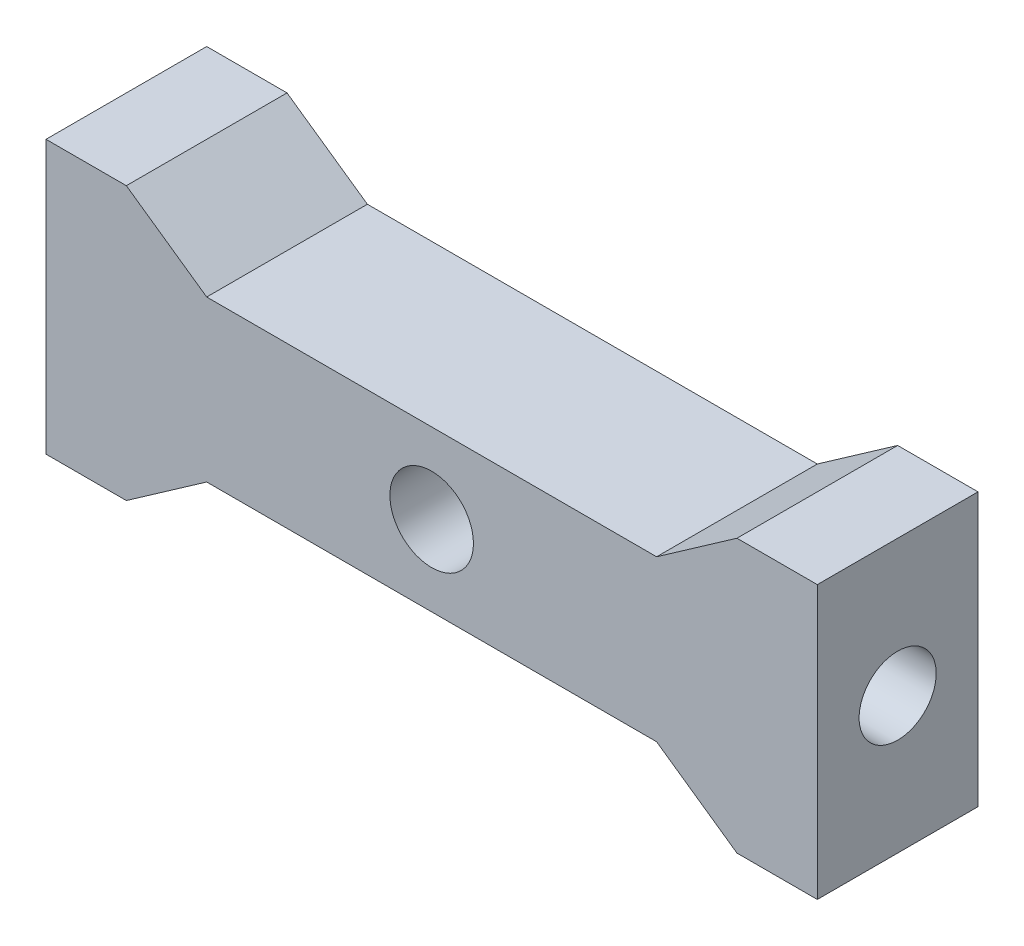
ISO-10303-21;
HEADER;
FILE_DESCRIPTION(('STEP AP214'),'2;1');
FILE_NAME('part.step','',(''),(''),'','','');
FILE_SCHEMA(('AUTOMOTIVE_DESIGN { 1 0 10303 214 1 1 1 1 }'));
ENDSEC;
DATA;
#1=APPLICATION_CONTEXT('core data for automotive mechanical design processes');
#2=APPLICATION_PROTOCOL_DEFINITION('international standard','automotive_design',2000,#1);
#3=PRODUCT_CONTEXT('',#1,'mechanical');
#4=PRODUCT('Part','Part','',(#3));
#5=PRODUCT_RELATED_PRODUCT_CATEGORY('part','',(#4));
#6=PRODUCT_DEFINITION_FORMATION('','',#4);
#7=PRODUCT_DEFINITION_CONTEXT('part definition',#1,'design');
#8=PRODUCT_DEFINITION('design','',#6,#7);
#9=PRODUCT_DEFINITION_SHAPE('','',#8);
#10=(LENGTH_UNIT() NAMED_UNIT(*) SI_UNIT(.MILLI.,.METRE.));
#11=(NAMED_UNIT(*) PLANE_ANGLE_UNIT() SI_UNIT($,.RADIAN.));
#12=(NAMED_UNIT(*) SI_UNIT($,.STERADIAN.) SOLID_ANGLE_UNIT());
#13=UNCERTAINTY_MEASURE_WITH_UNIT(LENGTH_MEASURE(1.E-05),#10,'distance_accuracy_value','');
#14=(GEOMETRIC_REPRESENTATION_CONTEXT(3) GLOBAL_UNCERTAINTY_ASSIGNED_CONTEXT((#13)) GLOBAL_UNIT_ASSIGNED_CONTEXT((#10,
#11,#12)) REPRESENTATION_CONTEXT('',''));
#15=CARTESIAN_POINT('',(0.,0.,0.));
#16=DIRECTION('',(0.,0.,1.));
#17=DIRECTION('',(1.,0.,0.));
#18=AXIS2_PLACEMENT_3D('',#15,#16,#17);
#19=CARTESIAN_POINT('',(-24.,8.485,10.));
#20=DIRECTION('',(0.,-1.,0.));
#21=DIRECTION('',(0.,0.,-1.));
#22=AXIS2_PLACEMENT_3D('',#19,#20,#21);
#23=PLANE('',#22);
#24=DIRECTION('',(-1.,0.,0.));
#25=VECTOR('',#24,1.);
#26=CARTESIAN_POINT('',(-24.,8.485,10.));
#27=LINE('',#26,#25);
#28=CARTESIAN_POINT('',(-19.,8.485,10.));
#29=VERTEX_POINT('',#28);
#30=CARTESIAN_POINT('',(-24.,8.485,10.));
#31=VERTEX_POINT('',#30);
#32=EDGE_CURVE('E245',#29,#31,#27,.T.);
#33=ORIENTED_EDGE('',*,*,#32,.F.);
#34=DIRECTION('',(0.,0.,1.));
#35=VECTOR('',#34,1.);
#36=CARTESIAN_POINT('',(-19.,8.485,0.));
#37=LINE('',#36,#35);
#38=CARTESIAN_POINT('',(-19.,8.485,0.));
#39=VERTEX_POINT('',#38);
#40=EDGE_CURVE('E175',#39,#29,#37,.T.);
#41=ORIENTED_EDGE('',*,*,#40,.F.);
#42=DIRECTION('',(-1.,0.,0.));
#43=VECTOR('',#42,1.);
#44=CARTESIAN_POINT('',(-24.,8.485,0.));
#45=LINE('',#44,#43);
#46=CARTESIAN_POINT('',(-24.,8.485,0.));
#47=VERTEX_POINT('',#46);
#48=EDGE_CURVE('E161',#39,#47,#45,.T.);
#49=ORIENTED_EDGE('',*,*,#48,.T.);
#50=DIRECTION('',(0.,0.,-1.));
#51=VECTOR('',#50,1.);
#52=CARTESIAN_POINT('',(-24.,8.485,10.));
#53=LINE('',#52,#51);
#54=EDGE_CURVE('E54',#31,#47,#53,.T.);
#55=ORIENTED_EDGE('',*,*,#54,.F.);
#56=EDGE_LOOP('',(#33,#41,#49,#55));
#57=FACE_BOUND('',#56,.T.);
#58=ADVANCED_FACE('F45',(#57),#23,.F.);
#59=CARTESIAN_POINT('',(-24.,-8.485,10.));
#60=DIRECTION('',(0.,1.,0.));
#61=DIRECTION('',(0.,0.,1.));
#62=AXIS2_PLACEMENT_3D('',#59,#60,#61);
#63=PLANE('',#62);
#64=DIRECTION('',(1.,0.,0.));
#65=VECTOR('',#64,1.);
#66=CARTESIAN_POINT('',(-24.,-8.485,0.));
#67=LINE('',#66,#65);
#68=CARTESIAN_POINT('',(-24.,-8.485,0.));
#69=VERTEX_POINT('',#68);
#70=CARTESIAN_POINT('',(-19.,-8.485,0.));
#71=VERTEX_POINT('',#70);
#72=EDGE_CURVE('E246',#69,#71,#67,.T.);
#73=ORIENTED_EDGE('',*,*,#72,.T.);
#74=DIRECTION('',(0.,0.,1.));
#75=VECTOR('',#74,1.);
#76=CARTESIAN_POINT('',(-19.,-8.485,0.));
#77=LINE('',#76,#75);
#78=CARTESIAN_POINT('',(-19.,-8.485,10.));
#79=VERTEX_POINT('',#78);
#80=EDGE_CURVE('E184',#71,#79,#77,.T.);
#81=ORIENTED_EDGE('',*,*,#80,.T.);
#82=DIRECTION('',(1.,0.,0.));
#83=VECTOR('',#82,1.);
#84=CARTESIAN_POINT('',(-24.,-8.485,10.));
#85=LINE('',#84,#83);
#86=CARTESIAN_POINT('',(-24.,-8.485,10.));
#87=VERTEX_POINT('',#86);
#88=EDGE_CURVE('E255',#87,#79,#85,.T.);
#89=ORIENTED_EDGE('',*,*,#88,.F.);
#90=DIRECTION('',(0.,0.,-1.));
#91=VECTOR('',#90,1.);
#92=CARTESIAN_POINT('',(-24.,-8.485,10.));
#93=LINE('',#92,#91);
#94=EDGE_CURVE('E277',#87,#69,#93,.T.);
#95=ORIENTED_EDGE('',*,*,#94,.T.);
#96=EDGE_LOOP('',(#73,#81,#89,#95));
#97=FACE_BOUND('',#96,.T.);
#98=ADVANCED_FACE('F292',(#97),#63,.F.);
#99=CARTESIAN_POINT('',(0.,0.,10.));
#100=DIRECTION('',(0.,0.,1.));
#101=DIRECTION('',(1.,0.,0.));
#102=AXIS2_PLACEMENT_3D('',#99,#100,#101);
#103=PLANE('',#102);
#104=DIRECTION('',(0.819231920519041,-0.573462344363328,0.));
#105=VECTOR('',#104,1.);
#106=CARTESIAN_POINT('',(-14.,4.985,10.));
#107=LINE('',#106,#105);
#108=CARTESIAN_POINT('',(-14.,4.985,10.));
#109=VERTEX_POINT('',#108);
#110=EDGE_CURVE('E141',#29,#109,#107,.T.);
#111=ORIENTED_EDGE('',*,*,#110,.F.);
#112=ORIENTED_EDGE('',*,*,#32,.T.);
#113=DIRECTION('',(0.,-1.,0.));
#114=VECTOR('',#113,1.);
#115=CARTESIAN_POINT('',(-24.,8.485,10.));
#116=LINE('',#115,#114);
#117=EDGE_CURVE('E251',#31,#87,#116,.T.);
#118=ORIENTED_EDGE('',*,*,#117,.T.);
#119=ORIENTED_EDGE('',*,*,#88,.T.);
#120=DIRECTION('',(-0.819231920519041,-0.573462344363328,0.));
#121=VECTOR('',#120,1.);
#122=CARTESIAN_POINT('',(-19.,-8.485,10.));
#123=LINE('',#122,#121);
#124=CARTESIAN_POINT('',(-14.,-4.985,10.));
#125=VERTEX_POINT('',#124);
#126=EDGE_CURVE('E172',#125,#79,#123,.T.);
#127=ORIENTED_EDGE('',*,*,#126,.F.);
#128=DIRECTION('',(-1.,0.,0.));
#129=VECTOR('',#128,1.);
#130=CARTESIAN_POINT('',(-14.,-4.985,10.));
#131=LINE('',#130,#129);
#132=CARTESIAN_POINT('',(14.,-4.985,10.));
#133=VERTEX_POINT('',#132);
#134=EDGE_CURVE('E198',#133,#125,#131,.T.);
#135=ORIENTED_EDGE('',*,*,#134,.F.);
#136=DIRECTION('',(-0.819231920519041,0.573462344363328,0.));
#137=VECTOR('',#136,1.);
#138=CARTESIAN_POINT('',(14.,-4.985,10.));
#139=LINE('',#138,#137);
#140=CARTESIAN_POINT('',(19.,-8.485,10.));
#141=VERTEX_POINT('',#140);
#142=EDGE_CURVE('E202',#141,#133,#139,.T.);
#143=ORIENTED_EDGE('',*,*,#142,.F.);
#144=CARTESIAN_POINT('',(24.,-8.485,10.));
#145=VERTEX_POINT('',#144);
#146=EDGE_CURVE('E254',#141,#145,#85,.T.);
#147=ORIENTED_EDGE('',*,*,#146,.T.);
#148=DIRECTION('',(0.,1.,0.));
#149=VECTOR('',#148,1.);
#150=CARTESIAN_POINT('',(24.,8.485,10.));
#151=LINE('',#150,#149);
#152=CARTESIAN_POINT('',(24.,8.485,10.));
#153=VERTEX_POINT('',#152);
#154=EDGE_CURVE('E241',#145,#153,#151,.T.);
#155=ORIENTED_EDGE('',*,*,#154,.T.);
#156=CARTESIAN_POINT('',(19.,8.485,10.));
#157=VERTEX_POINT('',#156);
#158=EDGE_CURVE('E247',#153,#157,#27,.T.);
#159=ORIENTED_EDGE('',*,*,#158,.T.);
#160=DIRECTION('',(0.81923192051904,0.573462344363328,0.));
#161=VECTOR('',#160,1.);
#162=CARTESIAN_POINT('',(14.,4.985,10.));
#163=LINE('',#162,#161);
#164=CARTESIAN_POINT('',(14.,4.985,10.));
#165=VERTEX_POINT('',#164);
#166=EDGE_CURVE('E61',#165,#157,#163,.T.);
#167=ORIENTED_EDGE('',*,*,#166,.F.);
#168=DIRECTION('',(1.,0.,0.));
#169=VECTOR('',#168,1.);
#170=CARTESIAN_POINT('',(-14.,4.985,10.));
#171=LINE('',#170,#169);
#172=EDGE_CURVE('E165',#109,#165,#171,.T.);
#173=ORIENTED_EDGE('',*,*,#172,.F.);
#174=EDGE_LOOP('',(#111,#112,#118,#119,#127,#135,#143,#147,#155,#159,#167,#173));
#175=FACE_BOUND('',#174,.T.);
#176=CARTESIAN_POINT('',(0.,0.,10.));
#177=DIRECTION('',(0.,0.,1.));
#178=DIRECTION('',(1.,0.,0.));
#179=AXIS2_PLACEMENT_3D('',#176,#177,#178);
#180=CIRCLE('',#179,2.6);
#181=CARTESIAN_POINT('',(2.6,0.,10.));
#182=VERTEX_POINT('',#181);
#183=EDGE_CURVE('E233',#182,#182,#180,.T.);
#184=ORIENTED_EDGE('',*,*,#183,.F.);
#185=EDGE_LOOP('',(#184));
#186=FACE_BOUND('',#185,.T.);
#187=ADVANCED_FACE('F296',(#175,#186),#103,.T.);
#188=CARTESIAN_POINT('',(0.,0.,0.));
#189=DIRECTION('',(0.,0.,1.));
#190=DIRECTION('',(1.,0.,0.));
#191=AXIS2_PLACEMENT_3D('',#188,#189,#190);
#192=PLANE('',#191);
#193=ORIENTED_EDGE('',*,*,#48,.F.);
#194=DIRECTION('',(0.819231920519041,-0.573462344363328,0.));
#195=VECTOR('',#194,1.);
#196=CARTESIAN_POINT('',(-14.,4.985,0.));
#197=LINE('',#196,#195);
#198=CARTESIAN_POINT('',(-14.,4.985,0.));
#199=VERTEX_POINT('',#198);
#200=EDGE_CURVE('E138',#39,#199,#197,.T.);
#201=ORIENTED_EDGE('',*,*,#200,.T.);
#202=DIRECTION('',(1.,0.,0.));
#203=VECTOR('',#202,1.);
#204=CARTESIAN_POINT('',(-14.,4.985,0.));
#205=LINE('',#204,#203);
#206=CARTESIAN_POINT('',(14.,4.985,0.));
#207=VERTEX_POINT('',#206);
#208=EDGE_CURVE('E150',#199,#207,#205,.T.);
#209=ORIENTED_EDGE('',*,*,#208,.T.);
#210=DIRECTION('',(0.81923192051904,0.573462344363328,0.));
#211=VECTOR('',#210,1.);
#212=CARTESIAN_POINT('',(14.,4.985,0.));
#213=LINE('',#212,#211);
#214=CARTESIAN_POINT('',(19.,8.485,0.));
#215=VERTEX_POINT('',#214);
#216=EDGE_CURVE('E147',#207,#215,#213,.T.);
#217=ORIENTED_EDGE('',*,*,#216,.T.);
#218=CARTESIAN_POINT('',(24.,8.485,0.));
#219=VERTEX_POINT('',#218);
#220=EDGE_CURVE('E263',#219,#215,#45,.T.);
#221=ORIENTED_EDGE('',*,*,#220,.F.);
#222=DIRECTION('',(0.,1.,0.));
#223=VECTOR('',#222,1.);
#224=CARTESIAN_POINT('',(24.,8.485,0.));
#225=LINE('',#224,#223);
#226=CARTESIAN_POINT('',(24.,-8.485,0.));
#227=VERTEX_POINT('',#226);
#228=EDGE_CURVE('E237',#227,#219,#225,.T.);
#229=ORIENTED_EDGE('',*,*,#228,.F.);
#230=CARTESIAN_POINT('',(19.,-8.485,0.));
#231=VERTEX_POINT('',#230);
#232=EDGE_CURVE('E270',#231,#227,#67,.T.);
#233=ORIENTED_EDGE('',*,*,#232,.F.);
#234=DIRECTION('',(-0.819231920519041,0.573462344363328,0.));
#235=VECTOR('',#234,1.);
#236=CARTESIAN_POINT('',(14.,-4.985,0.));
#237=LINE('',#236,#235);
#238=CARTESIAN_POINT('',(14.,-4.985,0.));
#239=VERTEX_POINT('',#238);
#240=EDGE_CURVE('E69',#231,#239,#237,.T.);
#241=ORIENTED_EDGE('',*,*,#240,.T.);
#242=DIRECTION('',(-1.,0.,0.));
#243=VECTOR('',#242,1.);
#244=CARTESIAN_POINT('',(-14.,-4.985,0.));
#245=LINE('',#244,#243);
#246=CARTESIAN_POINT('',(-14.,-4.985,0.));
#247=VERTEX_POINT('',#246);
#248=EDGE_CURVE('E188',#239,#247,#245,.T.);
#249=ORIENTED_EDGE('',*,*,#248,.T.);
#250=DIRECTION('',(-0.819231920519041,-0.573462344363328,0.));
#251=VECTOR('',#250,1.);
#252=CARTESIAN_POINT('',(-19.,-8.485,0.));
#253=LINE('',#252,#251);
#254=EDGE_CURVE('E203',#247,#71,#253,.T.);
#255=ORIENTED_EDGE('',*,*,#254,.T.);
#256=ORIENTED_EDGE('',*,*,#72,.F.);
#257=DIRECTION('',(0.,-1.,0.));
#258=VECTOR('',#257,1.);
#259=CARTESIAN_POINT('',(-24.,8.485,0.));
#260=LINE('',#259,#258);
#261=EDGE_CURVE('E267',#47,#69,#260,.T.);
#262=ORIENTED_EDGE('',*,*,#261,.F.);
#263=EDGE_LOOP('',(#193,#201,#209,#217,#221,#229,#233,#241,#249,#255,#256,#262));
#264=FACE_BOUND('',#263,.T.);
#265=CARTESIAN_POINT('',(0.,0.,0.));
#266=DIRECTION('',(0.,0.,1.));
#267=DIRECTION('',(1.,0.,0.));
#268=AXIS2_PLACEMENT_3D('',#265,#266,#267);
#269=CIRCLE('',#268,2.6);
#270=CARTESIAN_POINT('',(2.6,0.,0.));
#271=VERTEX_POINT('',#270);
#272=EDGE_CURVE('E229',#271,#271,#269,.T.);
#273=ORIENTED_EDGE('',*,*,#272,.T.);
#274=EDGE_LOOP('',(#273));
#275=FACE_BOUND('',#274,.T.);
#276=ADVANCED_FACE('F158',(#264,#275),#192,.F.);
#277=CARTESIAN_POINT('',(24.,8.485,10.));
#278=DIRECTION('',(-1.,0.,0.));
#279=DIRECTION('',(0.,0.,1.));
#280=AXIS2_PLACEMENT_3D('',#277,#278,#279);
#281=PLANE('',#280);
#282=CARTESIAN_POINT('',(24.,0.,5.));
#283=DIRECTION('',(1.,0.,0.));
#284=DIRECTION('',(0.,0.,-1.));
#285=AXIS2_PLACEMENT_3D('',#282,#283,#284);
#286=CIRCLE('',#285,2.4);
#287=CARTESIAN_POINT('',(24.,0.,2.6));
#288=VERTEX_POINT('',#287);
#289=EDGE_CURVE('E221',#288,#288,#286,.T.);
#290=ORIENTED_EDGE('',*,*,#289,.F.);
#291=EDGE_LOOP('',(#290));
#292=FACE_BOUND('',#291,.T.);
#293=ORIENTED_EDGE('',*,*,#228,.T.);
#294=DIRECTION('',(0.,0.,-1.));
#295=VECTOR('',#294,1.);
#296=CARTESIAN_POINT('',(24.,8.485,10.));
#297=LINE('',#296,#295);
#298=EDGE_CURVE('E11',#153,#219,#297,.T.);
#299=ORIENTED_EDGE('',*,*,#298,.F.);
#300=ORIENTED_EDGE('',*,*,#154,.F.);
#301=DIRECTION('',(0.,0.,-1.));
#302=VECTOR('',#301,1.);
#303=CARTESIAN_POINT('',(24.,-8.485,10.));
#304=LINE('',#303,#302);
#305=EDGE_CURVE('E259',#145,#227,#304,.T.);
#306=ORIENTED_EDGE('',*,*,#305,.T.);
#307=EDGE_LOOP('',(#293,#299,#300,#306));
#308=FACE_BOUND('',#307,.T.);
#309=ADVANCED_FACE('F47',(#292,#308),#281,.F.);
#310=ORIENTED_EDGE('',*,*,#220,.T.);
#311=DIRECTION('',(0.,0.,1.));
#312=VECTOR('',#311,1.);
#313=CARTESIAN_POINT('',(19.,8.485,0.));
#314=LINE('',#313,#312);
#315=EDGE_CURVE('E179',#215,#157,#314,.T.);
#316=ORIENTED_EDGE('',*,*,#315,.T.);
#317=ORIENTED_EDGE('',*,*,#158,.F.);
#318=ORIENTED_EDGE('',*,*,#298,.T.);
#319=EDGE_LOOP('',(#310,#316,#317,#318));
#320=FACE_BOUND('',#319,.T.);
#321=ADVANCED_FACE('F303',(#320),#23,.F.);
#322=CARTESIAN_POINT('',(-24.,8.485,10.));
#323=DIRECTION('',(1.,0.,0.));
#324=DIRECTION('',(0.,0.,-1.));
#325=AXIS2_PLACEMENT_3D('',#322,#323,#324);
#326=PLANE('',#325);
#327=CARTESIAN_POINT('',(-24.,0.,5.));
#328=DIRECTION('',(-1.,0.,0.));
#329=DIRECTION('',(0.,0.,1.));
#330=AXIS2_PLACEMENT_3D('',#327,#328,#329);
#331=CIRCLE('',#330,2.4);
#332=CARTESIAN_POINT('',(-24.,0.,7.4));
#333=VERTEX_POINT('',#332);
#334=EDGE_CURVE('E178',#333,#333,#331,.T.);
#335=ORIENTED_EDGE('',*,*,#334,.F.);
#336=EDGE_LOOP('',(#335));
#337=FACE_BOUND('',#336,.T.);
#338=ORIENTED_EDGE('',*,*,#261,.T.);
#339=ORIENTED_EDGE('',*,*,#94,.F.);
#340=ORIENTED_EDGE('',*,*,#117,.F.);
#341=ORIENTED_EDGE('',*,*,#54,.T.);
#342=EDGE_LOOP('',(#338,#339,#340,#341));
#343=FACE_BOUND('',#342,.T.);
#344=ADVANCED_FACE('F285',(#337,#343),#326,.F.);
#345=ORIENTED_EDGE('',*,*,#146,.F.);
#346=DIRECTION('',(0.,0.,1.));
#347=VECTOR('',#346,1.);
#348=CARTESIAN_POINT('',(19.,-8.485,0.));
#349=LINE('',#348,#347);
#350=EDGE_CURVE('E189',#231,#141,#349,.T.);
#351=ORIENTED_EDGE('',*,*,#350,.F.);
#352=ORIENTED_EDGE('',*,*,#232,.T.);
#353=ORIENTED_EDGE('',*,*,#305,.F.);
#354=EDGE_LOOP('',(#345,#351,#352,#353));
#355=FACE_BOUND('',#354,.T.);
#356=ADVANCED_FACE('F309',(#355),#63,.F.);
#357=CARTESIAN_POINT('',(0.,0.,10.));
#358=DIRECTION('',(0.,0.,-1.));
#359=DIRECTION('',(-1.,0.,0.));
#360=AXIS2_PLACEMENT_3D('',#357,#358,#359);
#361=CYLINDRICAL_SURFACE('',#360,2.6);
#362=ORIENTED_EDGE('',*,*,#183,.T.);
#363=EDGE_LOOP('',(#362));
#364=FACE_BOUND('',#363,.T.);
#365=ORIENTED_EDGE('',*,*,#272,.F.);
#366=EDGE_LOOP('',(#365));
#367=FACE_BOUND('',#366,.T.);
#368=ADVANCED_FACE('F362',(#364,#367),#361,.F.);
#369=CARTESIAN_POINT('',(18.,0.,5.));
#370=DIRECTION('',(1.,0.,0.));
#371=DIRECTION('',(0.,0.,-1.));
#372=AXIS2_PLACEMENT_3D('',#369,#370,#371);
#373=CYLINDRICAL_SURFACE('',#372,2.4);
#374=CARTESIAN_POINT('',(18.,0.,5.));
#375=DIRECTION('',(1.,0.,0.));
#376=DIRECTION('',(0.,0.,-1.));
#377=AXIS2_PLACEMENT_3D('',#374,#375,#376);
#378=CIRCLE('',#377,2.4);
#379=CARTESIAN_POINT('',(18.,0.,2.6));
#380=VERTEX_POINT('',#379);
#381=EDGE_CURVE('E225',#380,#380,#378,.T.);
#382=ORIENTED_EDGE('',*,*,#381,.F.);
#383=EDGE_LOOP('',(#382));
#384=FACE_BOUND('',#383,.T.);
#385=ORIENTED_EDGE('',*,*,#289,.T.);
#386=EDGE_LOOP('',(#385));
#387=FACE_BOUND('',#386,.T.);
#388=ADVANCED_FACE('F358',(#384,#387),#373,.F.);
#389=CARTESIAN_POINT('',(18.,0.,5.));
#390=DIRECTION('',(1.,0.,0.));
#391=DIRECTION('',(0.,0.,-1.));
#392=AXIS2_PLACEMENT_3D('',#389,#390,#391);
#393=PLANE('',#392);
#394=ORIENTED_EDGE('',*,*,#381,.T.);
#395=EDGE_LOOP('',(#394));
#396=FACE_BOUND('',#395,.T.);
#397=ADVANCED_FACE('F354',(#396),#393,.T.);
#398=CARTESIAN_POINT('',(-18.,0.,5.));
#399=DIRECTION('',(-1.,0.,0.));
#400=DIRECTION('',(0.,0.,1.));
#401=AXIS2_PLACEMENT_3D('',#398,#399,#400);
#402=CYLINDRICAL_SURFACE('',#401,2.4);
#403=CARTESIAN_POINT('',(-18.,0.,5.));
#404=DIRECTION('',(-1.,0.,0.));
#405=DIRECTION('',(0.,0.,1.));
#406=AXIS2_PLACEMENT_3D('',#403,#404,#405);
#407=CIRCLE('',#406,2.4);
#408=CARTESIAN_POINT('',(-18.,0.,7.4));
#409=VERTEX_POINT('',#408);
#410=EDGE_CURVE('E217',#409,#409,#407,.T.);
#411=ORIENTED_EDGE('',*,*,#410,.F.);
#412=EDGE_LOOP('',(#411));
#413=FACE_BOUND('',#412,.T.);
#414=ORIENTED_EDGE('',*,*,#334,.T.);
#415=EDGE_LOOP('',(#414));
#416=FACE_BOUND('',#415,.T.);
#417=ADVANCED_FACE('F344',(#413,#416),#402,.F.);
#418=CARTESIAN_POINT('',(-18.,0.,5.));
#419=DIRECTION('',(-1.,0.,0.));
#420=DIRECTION('',(0.,0.,1.));
#421=AXIS2_PLACEMENT_3D('',#418,#419,#420);
#422=PLANE('',#421);
#423=ORIENTED_EDGE('',*,*,#410,.T.);
#424=EDGE_LOOP('',(#423));
#425=FACE_BOUND('',#424,.T.);
#426=ADVANCED_FACE('F337',(#425),#422,.T.);
#427=CARTESIAN_POINT('',(-19.,-8.485,0.));
#428=DIRECTION('',(-0.573462344363328,0.819231920519041,0.));
#429=DIRECTION('',(-0.819231920519041,-0.573462344363328,0.));
#430=AXIS2_PLACEMENT_3D('',#427,#428,#429);
#431=PLANE('',#430);
#432=ORIENTED_EDGE('',*,*,#126,.T.);
#433=ORIENTED_EDGE('',*,*,#80,.F.);
#434=ORIENTED_EDGE('',*,*,#254,.F.);
#435=DIRECTION('',(0.,0.,1.));
#436=VECTOR('',#435,1.);
#437=CARTESIAN_POINT('',(-14.,-4.985,0.));
#438=LINE('',#437,#436);
#439=EDGE_CURVE('E195',#247,#125,#438,.T.);
#440=ORIENTED_EDGE('',*,*,#439,.T.);
#441=EDGE_LOOP('',(#432,#433,#434,#440));
#442=FACE_BOUND('',#441,.T.);
#443=ADVANCED_FACE('F335',(#442),#431,.F.);
#444=CARTESIAN_POINT('',(-14.,-4.985,0.));
#445=DIRECTION('',(0.,1.,0.));
#446=DIRECTION('',(0.,0.,1.));
#447=AXIS2_PLACEMENT_3D('',#444,#445,#446);
#448=PLANE('',#447);
#449=ORIENTED_EDGE('',*,*,#134,.T.);
#450=ORIENTED_EDGE('',*,*,#439,.F.);
#451=ORIENTED_EDGE('',*,*,#248,.F.);
#452=DIRECTION('',(0.,0.,1.));
#453=VECTOR('',#452,1.);
#454=CARTESIAN_POINT('',(14.,-4.985,0.));
#455=LINE('',#454,#453);
#456=EDGE_CURVE('E192',#239,#133,#455,.T.);
#457=ORIENTED_EDGE('',*,*,#456,.T.);
#458=EDGE_LOOP('',(#449,#450,#451,#457));
#459=FACE_BOUND('',#458,.T.);
#460=ADVANCED_FACE('F333',(#459),#448,.F.);
#461=CARTESIAN_POINT('',(14.,-4.985,0.));
#462=DIRECTION('',(0.573462344363328,0.819231920519041,0.));
#463=DIRECTION('',(-0.819231920519041,0.573462344363328,0.));
#464=AXIS2_PLACEMENT_3D('',#461,#462,#463);
#465=PLANE('',#464);
#466=ORIENTED_EDGE('',*,*,#142,.T.);
#467=ORIENTED_EDGE('',*,*,#456,.F.);
#468=ORIENTED_EDGE('',*,*,#240,.F.);
#469=ORIENTED_EDGE('',*,*,#350,.T.);
#470=EDGE_LOOP('',(#466,#467,#468,#469));
#471=FACE_BOUND('',#470,.T.);
#472=ADVANCED_FACE('F342',(#471),#465,.F.);
#473=CARTESIAN_POINT('',(-14.,4.985,0.));
#474=DIRECTION('',(-0.573462344363328,-0.819231920519041,0.));
#475=DIRECTION('',(0.819231920519041,-0.573462344363328,0.));
#476=AXIS2_PLACEMENT_3D('',#473,#474,#475);
#477=PLANE('',#476);
#478=ORIENTED_EDGE('',*,*,#110,.T.);
#479=DIRECTION('',(0.,0.,1.));
#480=VECTOR('',#479,1.);
#481=CARTESIAN_POINT('',(-14.,4.985,0.));
#482=LINE('',#481,#480);
#483=EDGE_CURVE('E134',#199,#109,#482,.T.);
#484=ORIENTED_EDGE('',*,*,#483,.F.);
#485=ORIENTED_EDGE('',*,*,#200,.F.);
#486=ORIENTED_EDGE('',*,*,#40,.T.);
#487=EDGE_LOOP('',(#478,#484,#485,#486));
#488=FACE_BOUND('',#487,.T.);
#489=ADVANCED_FACE('F136',(#488),#477,.F.);
#490=CARTESIAN_POINT('',(14.,4.985,0.));
#491=DIRECTION('',(0.573462344363328,-0.81923192051904,0.));
#492=DIRECTION('',(0.81923192051904,0.573462344363328,0.));
#493=AXIS2_PLACEMENT_3D('',#490,#491,#492);
#494=PLANE('',#493);
#495=ORIENTED_EDGE('',*,*,#166,.T.);
#496=ORIENTED_EDGE('',*,*,#315,.F.);
#497=ORIENTED_EDGE('',*,*,#216,.F.);
#498=DIRECTION('',(0.,0.,1.));
#499=VECTOR('',#498,1.);
#500=CARTESIAN_POINT('',(14.,4.985,0.));
#501=LINE('',#500,#499);
#502=EDGE_CURVE('E146',#207,#165,#501,.T.);
#503=ORIENTED_EDGE('',*,*,#502,.T.);
#504=EDGE_LOOP('',(#495,#496,#497,#503));
#505=FACE_BOUND('',#504,.T.);
#506=ADVANCED_FACE('F324',(#505),#494,.F.);
#507=CARTESIAN_POINT('',(-14.,4.985,0.));
#508=DIRECTION('',(0.,-1.,0.));
#509=DIRECTION('',(0.,0.,-1.));
#510=AXIS2_PLACEMENT_3D('',#507,#508,#509);
#511=PLANE('',#510);
#512=ORIENTED_EDGE('',*,*,#172,.T.);
#513=ORIENTED_EDGE('',*,*,#502,.F.);
#514=ORIENTED_EDGE('',*,*,#208,.F.);
#515=ORIENTED_EDGE('',*,*,#483,.T.);
#516=EDGE_LOOP('',(#512,#513,#514,#515));
#517=FACE_BOUND('',#516,.T.);
#518=ADVANCED_FACE('F151',(#517),#511,.F.);
#519=CLOSED_SHELL('',(#58,#98,#187,#276,#309,#321,#344,#356,#368,#388,#397,#417,#426,#443,#460,
#472,#489,#506,#518));
#520=MANIFOLD_SOLID_BREP('B2',#519);
#521=ADVANCED_BREP_SHAPE_REPRESENTATION('',(#18,#520),#14);
#522=SHAPE_DEFINITION_REPRESENTATION(#9,#521);
ENDSEC;
END-ISO-10303-21;
